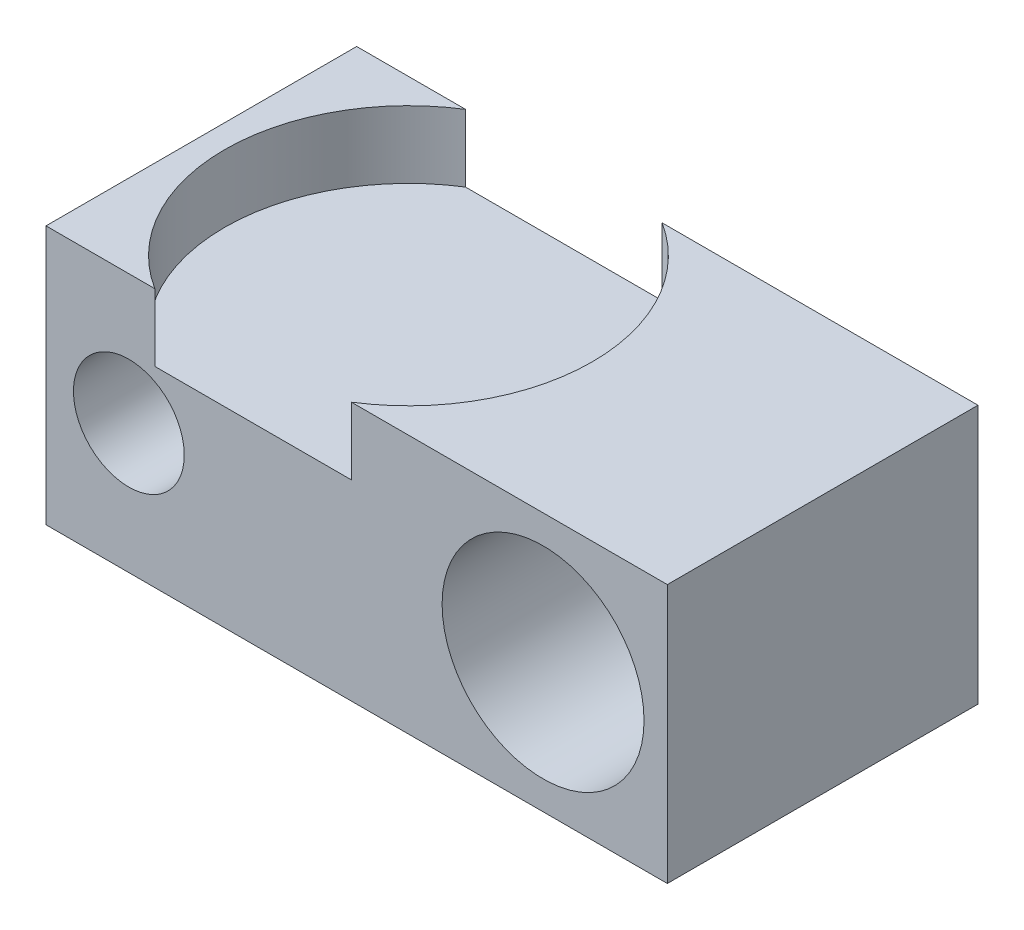
ISO-10303-21;
HEADER;
FILE_DESCRIPTION(('STEP AP214'),'2;1');
FILE_NAME('part.step','',(''),(''),'','','');
FILE_SCHEMA(('AUTOMOTIVE_DESIGN { 1 0 10303 214 1 1 1 1 }'));
ENDSEC;
DATA;
#1=APPLICATION_CONTEXT('core data for automotive mechanical design processes');
#2=APPLICATION_PROTOCOL_DEFINITION('international standard','automotive_design',2000,#1);
#3=PRODUCT_CONTEXT('',#1,'mechanical');
#4=PRODUCT('Part','Part','',(#3));
#5=PRODUCT_RELATED_PRODUCT_CATEGORY('part','',(#4));
#6=PRODUCT_DEFINITION_FORMATION('','',#4);
#7=PRODUCT_DEFINITION_CONTEXT('part definition',#1,'design');
#8=PRODUCT_DEFINITION('design','',#6,#7);
#9=PRODUCT_DEFINITION_SHAPE('','',#8);
#10=(LENGTH_UNIT() NAMED_UNIT(*) SI_UNIT(.MILLI.,.METRE.));
#11=(NAMED_UNIT(*) PLANE_ANGLE_UNIT() SI_UNIT($,.RADIAN.));
#12=(NAMED_UNIT(*) SI_UNIT($,.STERADIAN.) SOLID_ANGLE_UNIT());
#13=UNCERTAINTY_MEASURE_WITH_UNIT(LENGTH_MEASURE(1.E-05),#10,'distance_accuracy_value','');
#14=(GEOMETRIC_REPRESENTATION_CONTEXT(3) GLOBAL_UNCERTAINTY_ASSIGNED_CONTEXT((#13)) GLOBAL_UNIT_ASSIGNED_CONTEXT((#10,
#11,#12)) REPRESENTATION_CONTEXT('',''));
#15=CARTESIAN_POINT('',(0.,0.,0.));
#16=DIRECTION('',(0.,0.,1.));
#17=DIRECTION('',(1.,0.,0.));
#18=AXIS2_PLACEMENT_3D('',#15,#16,#17);
#19=CARTESIAN_POINT('',(0.,0.,30.));
#20=DIRECTION('',(0.,0.,-1.));
#21=DIRECTION('',(-1.,0.,0.));
#22=AXIS2_PLACEMENT_3D('',#19,#20,#21);
#23=PLANE('',#22);
#24=DIRECTION('',(1.,0.,0.));
#25=VECTOR('',#24,1.);
#26=CARTESIAN_POINT('',(0.,6.,30.));
#27=LINE('',#26,#25);
#28=CARTESIAN_POINT('',(-19.4901264480512,6.,30.));
#29=VERTEX_POINT('',#28);
#30=CARTESIAN_POINT('',(-0.509873551948835,6.,30.));
#31=VERTEX_POINT('',#30);
#32=EDGE_CURVE('E116',#29,#31,#27,.T.);
#33=ORIENTED_EDGE('',*,*,#32,.F.);
#34=DIRECTION('',(0.,-1.,0.));
#35=VECTOR('',#34,1.);
#36=CARTESIAN_POINT('',(-19.4901264480512,12.5001,30.));
#37=LINE('',#36,#35);
#38=CARTESIAN_POINT('',(-19.4901264480512,12.5001,30.));
#39=VERTEX_POINT('',#38);
#40=EDGE_CURVE('E169',#39,#29,#37,.T.);
#41=ORIENTED_EDGE('',*,*,#40,.F.);
#42=DIRECTION('',(1.,0.,0.));
#43=VECTOR('',#42,1.);
#44=CARTESIAN_POINT('',(0.,12.5001,30.));
#45=LINE('',#44,#43);
#46=CARTESIAN_POINT('',(-30.,12.5001,30.));
#47=VERTEX_POINT('',#46);
#48=EDGE_CURVE('E79',#47,#39,#45,.T.);
#49=ORIENTED_EDGE('',*,*,#48,.F.);
#50=DIRECTION('',(0.,-1.,0.));
#51=VECTOR('',#50,1.);
#52=CARTESIAN_POINT('',(-30.,-12.5,30.));
#53=LINE('',#52,#51);
#54=CARTESIAN_POINT('',(-30.,-12.5,30.));
#55=VERTEX_POINT('',#54);
#56=EDGE_CURVE('E195',#47,#55,#53,.T.);
#57=ORIENTED_EDGE('',*,*,#56,.T.);
#58=DIRECTION('',(1.,0.,0.));
#59=VECTOR('',#58,1.);
#60=CARTESIAN_POINT('',(-30.,-12.5,30.));
#61=LINE('',#60,#59);
#62=CARTESIAN_POINT('',(30.,-12.5,30.));
#63=VERTEX_POINT('',#62);
#64=EDGE_CURVE('E59',#55,#63,#61,.T.);
#65=ORIENTED_EDGE('',*,*,#64,.T.);
#66=DIRECTION('',(0.,1.,0.));
#67=VECTOR('',#66,1.);
#68=CARTESIAN_POINT('',(30.,-12.5,30.));
#69=LINE('',#68,#67);
#70=CARTESIAN_POINT('',(30.,12.5001,30.));
#71=VERTEX_POINT('',#70);
#72=EDGE_CURVE('E192',#63,#71,#69,.T.);
#73=ORIENTED_EDGE('',*,*,#72,.T.);
#74=DIRECTION('',(1.,0.,0.));
#75=VECTOR('',#74,1.);
#76=CARTESIAN_POINT('',(0.,12.5001,30.));
#77=LINE('',#76,#75);
#78=CARTESIAN_POINT('',(-0.509873551948835,12.5001,30.));
#79=VERTEX_POINT('',#78);
#80=EDGE_CURVE('E118',#79,#71,#77,.T.);
#81=ORIENTED_EDGE('',*,*,#80,.F.);
#82=DIRECTION('',(0.,-1.,0.));
#83=VECTOR('',#82,1.);
#84=CARTESIAN_POINT('',(-0.509873551948835,12.5001,30.));
#85=LINE('',#84,#83);
#86=EDGE_CURVE('E113',#79,#31,#85,.T.);
#87=ORIENTED_EDGE('',*,*,#86,.T.);
#88=EDGE_LOOP('',(#33,#41,#49,#57,#65,#73,#81,#87));
#89=FACE_BOUND('',#88,.T.);
#90=CARTESIAN_POINT('',(18.,0.,30.));
#91=DIRECTION('',(0.,0.,1.));
#92=DIRECTION('',(1.,0.,0.));
#93=AXIS2_PLACEMENT_3D('',#90,#91,#92);
#94=CIRCLE('',#93,9.75);
#95=CARTESIAN_POINT('',(27.75,0.,30.));
#96=VERTEX_POINT('',#95);
#97=EDGE_CURVE('E184',#96,#96,#94,.T.);
#98=ORIENTED_EDGE('',*,*,#97,.F.);
#99=EDGE_LOOP('',(#98));
#100=FACE_BOUND('',#99,.T.);
#101=CARTESIAN_POINT('',(-22.,0.,30.));
#102=DIRECTION('',(0.,0.,1.));
#103=DIRECTION('',(1.,0.,0.));
#104=AXIS2_PLACEMENT_3D('',#101,#102,#103);
#105=CIRCLE('',#104,5.35);
#106=CARTESIAN_POINT('',(-16.65,0.,30.));
#107=VERTEX_POINT('',#106);
#108=EDGE_CURVE('E176',#107,#107,#105,.T.);
#109=ORIENTED_EDGE('',*,*,#108,.F.);
#110=EDGE_LOOP('',(#109));
#111=FACE_BOUND('',#110,.T.);
#112=ADVANCED_FACE('F41',(#89,#100,#111),#23,.F.);
#113=CARTESIAN_POINT('',(0.,0.,0.));
#114=DIRECTION('',(0.,0.,-1.));
#115=DIRECTION('',(-1.,0.,0.));
#116=AXIS2_PLACEMENT_3D('',#113,#114,#115);
#117=PLANE('',#116);
#118=DIRECTION('',(0.,-1.,0.));
#119=VECTOR('',#118,1.);
#120=CARTESIAN_POINT('',(-19.4901264480512,12.5001,0.));
#121=LINE('',#120,#119);
#122=CARTESIAN_POINT('',(-19.4901264480512,12.5001,0.));
#123=VERTEX_POINT('',#122);
#124=CARTESIAN_POINT('',(-19.4901264480512,6.,0.));
#125=VERTEX_POINT('',#124);
#126=EDGE_CURVE('E172',#123,#125,#121,.T.);
#127=ORIENTED_EDGE('',*,*,#126,.T.);
#128=DIRECTION('',(1.,0.,0.));
#129=VECTOR('',#128,1.);
#130=CARTESIAN_POINT('',(0.,6.,0.));
#131=LINE('',#130,#129);
#132=CARTESIAN_POINT('',(-0.509873551948835,6.,0.));
#133=VERTEX_POINT('',#132);
#134=EDGE_CURVE('E11',#125,#133,#131,.T.);
#135=ORIENTED_EDGE('',*,*,#134,.T.);
#136=DIRECTION('',(0.,-1.,0.));
#137=VECTOR('',#136,1.);
#138=CARTESIAN_POINT('',(-0.509873551948835,12.5001,0.));
#139=LINE('',#138,#137);
#140=CARTESIAN_POINT('',(-0.509873551948835,12.5001,0.));
#141=VERTEX_POINT('',#140);
#142=EDGE_CURVE('E125',#141,#133,#139,.T.);
#143=ORIENTED_EDGE('',*,*,#142,.F.);
#144=DIRECTION('',(-1.,0.,0.));
#145=VECTOR('',#144,1.);
#146=CARTESIAN_POINT('',(0.,12.5001,0.));
#147=LINE('',#146,#145);
#148=CARTESIAN_POINT('',(30.,12.5001,0.));
#149=VERTEX_POINT('',#148);
#150=EDGE_CURVE('E152',#149,#141,#147,.T.);
#151=ORIENTED_EDGE('',*,*,#150,.F.);
#152=DIRECTION('',(0.,1.,0.));
#153=VECTOR('',#152,1.);
#154=CARTESIAN_POINT('',(30.,-12.5,0.));
#155=LINE('',#154,#153);
#156=CARTESIAN_POINT('',(30.,-12.5,0.));
#157=VERTEX_POINT('',#156);
#158=EDGE_CURVE('E188',#157,#149,#155,.T.);
#159=ORIENTED_EDGE('',*,*,#158,.F.);
#160=DIRECTION('',(1.,0.,0.));
#161=VECTOR('',#160,1.);
#162=CARTESIAN_POINT('',(-30.,-12.5,0.));
#163=LINE('',#162,#161);
#164=CARTESIAN_POINT('',(-30.,-12.5,0.));
#165=VERTEX_POINT('',#164);
#166=EDGE_CURVE('E196',#165,#157,#163,.T.);
#167=ORIENTED_EDGE('',*,*,#166,.F.);
#168=DIRECTION('',(0.,-1.,0.));
#169=VECTOR('',#168,1.);
#170=CARTESIAN_POINT('',(-30.,-12.5,0.));
#171=LINE('',#170,#169);
#172=CARTESIAN_POINT('',(-30.,12.5001,0.));
#173=VERTEX_POINT('',#172);
#174=EDGE_CURVE('E70',#173,#165,#171,.T.);
#175=ORIENTED_EDGE('',*,*,#174,.F.);
#176=DIRECTION('',(-1.,0.,0.));
#177=VECTOR('',#176,1.);
#178=CARTESIAN_POINT('',(0.,12.5001,0.));
#179=LINE('',#178,#177);
#180=EDGE_CURVE('E160',#123,#173,#179,.T.);
#181=ORIENTED_EDGE('',*,*,#180,.F.);
#182=EDGE_LOOP('',(#127,#135,#143,#151,#159,#167,#175,#181));
#183=FACE_BOUND('',#182,.T.);
#184=CARTESIAN_POINT('',(18.,0.,0.));
#185=DIRECTION('',(0.,0.,1.));
#186=DIRECTION('',(1.,0.,0.));
#187=AXIS2_PLACEMENT_3D('',#184,#185,#186);
#188=CIRCLE('',#187,9.75);
#189=CARTESIAN_POINT('',(27.75,0.,0.));
#190=VERTEX_POINT('',#189);
#191=EDGE_CURVE('E180',#190,#190,#188,.T.);
#192=ORIENTED_EDGE('',*,*,#191,.T.);
#193=EDGE_LOOP('',(#192));
#194=FACE_BOUND('',#193,.T.);
#195=CARTESIAN_POINT('',(-22.,0.,0.));
#196=DIRECTION('',(0.,0.,1.));
#197=DIRECTION('',(1.,0.,0.));
#198=AXIS2_PLACEMENT_3D('',#195,#196,#197);
#199=CIRCLE('',#198,5.35);
#200=CARTESIAN_POINT('',(-16.65,0.,0.));
#201=VERTEX_POINT('',#200);
#202=EDGE_CURVE('E175',#201,#201,#199,.T.);
#203=ORIENTED_EDGE('',*,*,#202,.T.);
#204=EDGE_LOOP('',(#203));
#205=FACE_BOUND('',#204,.T.);
#206=ADVANCED_FACE('F216',(#183,#194,#205),#117,.T.);
#207=CARTESIAN_POINT('',(30.,-12.5,30.));
#208=DIRECTION('',(-1.,0.,0.));
#209=DIRECTION('',(0.,0.,1.));
#210=AXIS2_PLACEMENT_3D('',#207,#208,#209);
#211=PLANE('',#210);
#212=ORIENTED_EDGE('',*,*,#158,.T.);
#213=DIRECTION('',(0.,0.,-1.));
#214=VECTOR('',#213,1.);
#215=CARTESIAN_POINT('',(30.,12.5001,0.));
#216=LINE('',#215,#214);
#217=EDGE_CURVE('E148',#71,#149,#216,.T.);
#218=ORIENTED_EDGE('',*,*,#217,.F.);
#219=ORIENTED_EDGE('',*,*,#72,.F.);
#220=DIRECTION('',(0.,0.,-1.));
#221=VECTOR('',#220,1.);
#222=CARTESIAN_POINT('',(30.,-12.5,30.));
#223=LINE('',#222,#221);
#224=EDGE_CURVE('E201',#63,#157,#223,.T.);
#225=ORIENTED_EDGE('',*,*,#224,.T.);
#226=EDGE_LOOP('',(#212,#218,#219,#225));
#227=FACE_BOUND('',#226,.T.);
#228=ADVANCED_FACE('F43',(#227),#211,.F.);
#229=CARTESIAN_POINT('',(-30.,-12.5,30.));
#230=DIRECTION('',(1.,0.,0.));
#231=DIRECTION('',(0.,0.,-1.));
#232=AXIS2_PLACEMENT_3D('',#229,#230,#231);
#233=PLANE('',#232);
#234=ORIENTED_EDGE('',*,*,#174,.T.);
#235=DIRECTION('',(0.,0.,-1.));
#236=VECTOR('',#235,1.);
#237=CARTESIAN_POINT('',(-30.,-12.5,30.));
#238=LINE('',#237,#236);
#239=EDGE_CURVE('E51',#55,#165,#238,.T.);
#240=ORIENTED_EDGE('',*,*,#239,.F.);
#241=ORIENTED_EDGE('',*,*,#56,.F.);
#242=DIRECTION('',(0.,0.,1.));
#243=VECTOR('',#242,1.);
#244=CARTESIAN_POINT('',(-30.,12.5001,0.));
#245=LINE('',#244,#243);
#246=EDGE_CURVE('E164',#173,#47,#245,.T.);
#247=ORIENTED_EDGE('',*,*,#246,.F.);
#248=EDGE_LOOP('',(#234,#240,#241,#247));
#249=FACE_BOUND('',#248,.T.);
#250=ADVANCED_FACE('F227',(#249),#233,.F.);
#251=CARTESIAN_POINT('',(-30.,-12.5,30.));
#252=DIRECTION('',(0.,1.,0.));
#253=DIRECTION('',(0.,0.,1.));
#254=AXIS2_PLACEMENT_3D('',#251,#252,#253);
#255=PLANE('',#254);
#256=ORIENTED_EDGE('',*,*,#166,.T.);
#257=ORIENTED_EDGE('',*,*,#224,.F.);
#258=ORIENTED_EDGE('',*,*,#64,.F.);
#259=ORIENTED_EDGE('',*,*,#239,.T.);
#260=EDGE_LOOP('',(#256,#257,#258,#259));
#261=FACE_BOUND('',#260,.T.);
#262=ADVANCED_FACE('F213',(#261),#255,.F.);
#263=CARTESIAN_POINT('',(18.,0.,30.));
#264=DIRECTION('',(0.,0.,-1.));
#265=DIRECTION('',(-1.,0.,0.));
#266=AXIS2_PLACEMENT_3D('',#263,#264,#265);
#267=CYLINDRICAL_SURFACE('',#266,9.75);
#268=ORIENTED_EDGE('',*,*,#97,.T.);
#269=EDGE_LOOP('',(#268));
#270=FACE_BOUND('',#269,.T.);
#271=ORIENTED_EDGE('',*,*,#191,.F.);
#272=EDGE_LOOP('',(#271));
#273=FACE_BOUND('',#272,.T.);
#274=ADVANCED_FACE('F245',(#270,#273),#267,.F.);
#275=CARTESIAN_POINT('',(-22.,0.,30.));
#276=DIRECTION('',(0.,0.,-1.));
#277=DIRECTION('',(-1.,0.,0.));
#278=AXIS2_PLACEMENT_3D('',#275,#276,#277);
#279=CYLINDRICAL_SURFACE('',#278,5.35);
#280=ORIENTED_EDGE('',*,*,#108,.T.);
#281=EDGE_LOOP('',(#280));
#282=FACE_BOUND('',#281,.T.);
#283=ORIENTED_EDGE('',*,*,#202,.F.);
#284=EDGE_LOOP('',(#283));
#285=FACE_BOUND('',#284,.T.);
#286=ADVANCED_FACE('F236',(#282,#285),#279,.F.);
#287=CARTESIAN_POINT('',(-10.,12.5001,15.));
#288=DIRECTION('',(0.,-1.,0.));
#289=DIRECTION('',(0.,0.,-1.));
#290=AXIS2_PLACEMENT_3D('',#287,#288,#289);
#291=CYLINDRICAL_SURFACE('',#290,17.75);
#292=ORIENTED_EDGE('',*,*,#40,.T.);
#293=CARTESIAN_POINT('',(-10.,6.,15.));
#294=DIRECTION('',(0.,1.,0.));
#295=DIRECTION('',(0.,0.,1.));
#296=AXIS2_PLACEMENT_3D('',#293,#294,#295);
#297=CIRCLE('',#296,17.75);
#298=EDGE_CURVE('E134',#125,#29,#297,.T.);
#299=ORIENTED_EDGE('',*,*,#298,.F.);
#300=ORIENTED_EDGE('',*,*,#126,.F.);
#301=CARTESIAN_POINT('',(-10.,12.5001,15.));
#302=DIRECTION('',(0.,1.,0.));
#303=DIRECTION('',(0.,0.,1.));
#304=AXIS2_PLACEMENT_3D('',#301,#302,#303);
#305=CIRCLE('',#304,17.75);
#306=EDGE_CURVE('E124',#123,#39,#305,.T.);
#307=ORIENTED_EDGE('',*,*,#306,.T.);
#308=EDGE_LOOP('',(#292,#299,#300,#307));
#309=FACE_BOUND('',#308,.T.);
#310=ADVANCED_FACE('F226',(#309),#291,.F.);
#311=CARTESIAN_POINT('',(0.,12.5001,0.));
#312=DIRECTION('',(0.,1.,0.));
#313=DIRECTION('',(0.,0.,1.));
#314=AXIS2_PLACEMENT_3D('',#311,#312,#313);
#315=PLANE('',#314);
#316=ORIENTED_EDGE('',*,*,#306,.F.);
#317=ORIENTED_EDGE('',*,*,#180,.T.);
#318=ORIENTED_EDGE('',*,*,#246,.T.);
#319=ORIENTED_EDGE('',*,*,#48,.T.);
#320=EDGE_LOOP('',(#316,#317,#318,#319));
#321=FACE_BOUND('',#320,.T.);
#322=ADVANCED_FACE('F228',(#321),#315,.T.);
#323=CARTESIAN_POINT('',(-10.,12.5001,15.));
#324=DIRECTION('',(0.,-1.,0.));
#325=DIRECTION('',(0.,0.,-1.));
#326=AXIS2_PLACEMENT_3D('',#323,#324,#325);
#327=CYLINDRICAL_SURFACE('',#326,17.75);
#328=ORIENTED_EDGE('',*,*,#142,.T.);
#329=EDGE_CURVE('E132',#31,#133,#297,.T.);
#330=ORIENTED_EDGE('',*,*,#329,.F.);
#331=ORIENTED_EDGE('',*,*,#86,.F.);
#332=CARTESIAN_POINT('',(-10.,12.5001,15.));
#333=DIRECTION('',(0.,1.,0.));
#334=DIRECTION('',(0.,0.,1.));
#335=AXIS2_PLACEMENT_3D('',#332,#333,#334);
#336=CIRCLE('',#335,17.75);
#337=EDGE_CURVE('E136',#79,#141,#336,.T.);
#338=ORIENTED_EDGE('',*,*,#337,.T.);
#339=EDGE_LOOP('',(#328,#330,#331,#338));
#340=FACE_BOUND('',#339,.T.);
#341=ADVANCED_FACE('F138',(#340),#327,.F.);
#342=CARTESIAN_POINT('',(0.,12.5001,0.));
#343=DIRECTION('',(0.,1.,0.));
#344=DIRECTION('',(0.,0.,1.));
#345=AXIS2_PLACEMENT_3D('',#342,#343,#344);
#346=PLANE('',#345);
#347=ORIENTED_EDGE('',*,*,#337,.F.);
#348=ORIENTED_EDGE('',*,*,#80,.T.);
#349=ORIENTED_EDGE('',*,*,#217,.T.);
#350=ORIENTED_EDGE('',*,*,#150,.T.);
#351=EDGE_LOOP('',(#347,#348,#349,#350));
#352=FACE_BOUND('',#351,.T.);
#353=ADVANCED_FACE('F224',(#352),#346,.T.);
#354=CARTESIAN_POINT('',(-10.,6.,15.));
#355=DIRECTION('',(0.,1.,0.));
#356=DIRECTION('',(0.,0.,1.));
#357=AXIS2_PLACEMENT_3D('',#354,#355,#356);
#358=PLANE('',#357);
#359=ORIENTED_EDGE('',*,*,#32,.T.);
#360=ORIENTED_EDGE('',*,*,#329,.T.);
#361=ORIENTED_EDGE('',*,*,#134,.F.);
#362=ORIENTED_EDGE('',*,*,#298,.T.);
#363=EDGE_LOOP('',(#359,#360,#361,#362));
#364=FACE_BOUND('',#363,.T.);
#365=ADVANCED_FACE('F130',(#364),#358,.T.);
#366=CLOSED_SHELL('',(#112,#206,#228,#250,#262,#274,#286,#310,#322,#341,#353,#365));
#367=MANIFOLD_SOLID_BREP('B2',#366);
#368=ADVANCED_BREP_SHAPE_REPRESENTATION('',(#18,#367),#14);
#369=SHAPE_DEFINITION_REPRESENTATION(#9,#368);
ENDSEC;
END-ISO-10303-21;
